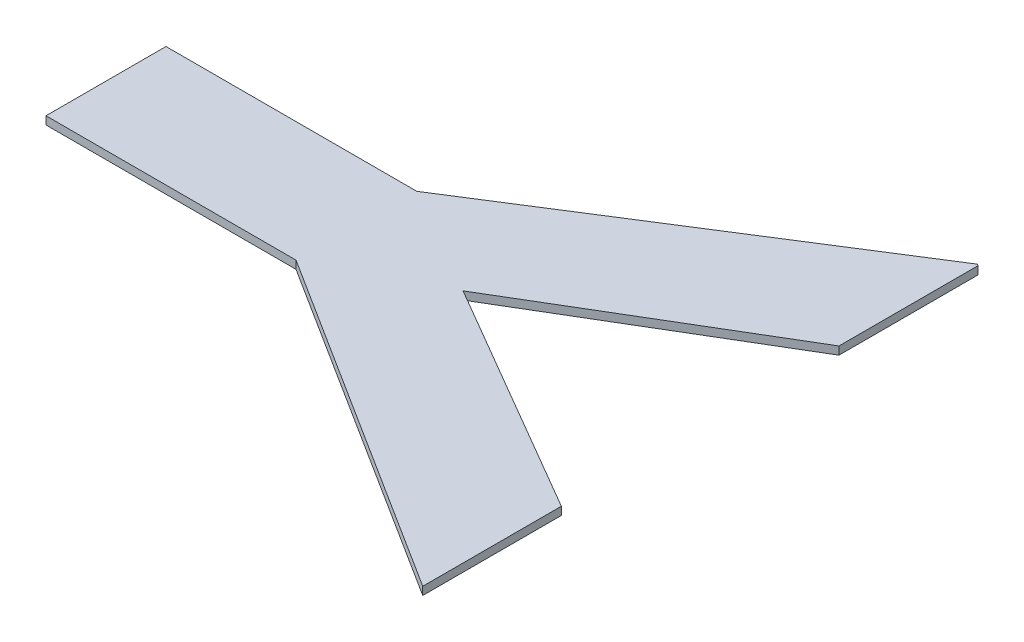
ISO-10303-21;
HEADER;
FILE_DESCRIPTION(('STEP AP214'),'2;1');
FILE_NAME('part.step','',(''),(''),'','','');
FILE_SCHEMA(('AUTOMOTIVE_DESIGN { 1 0 10303 214 1 1 1 1 }'));
ENDSEC;
DATA;
#1=APPLICATION_CONTEXT('core data for automotive mechanical design processes');
#2=APPLICATION_PROTOCOL_DEFINITION('international standard','automotive_design',2000,#1);
#3=PRODUCT_CONTEXT('',#1,'mechanical');
#4=PRODUCT('Part','Part','',(#3));
#5=PRODUCT_RELATED_PRODUCT_CATEGORY('part','',(#4));
#6=PRODUCT_DEFINITION_FORMATION('','',#4);
#7=PRODUCT_DEFINITION_CONTEXT('part definition',#1,'design');
#8=PRODUCT_DEFINITION('design','',#6,#7);
#9=PRODUCT_DEFINITION_SHAPE('','',#8);
#10=(LENGTH_UNIT() NAMED_UNIT(*) SI_UNIT(.MILLI.,.METRE.));
#11=(NAMED_UNIT(*) PLANE_ANGLE_UNIT() SI_UNIT($,.RADIAN.));
#12=(NAMED_UNIT(*) SI_UNIT($,.STERADIAN.) SOLID_ANGLE_UNIT());
#13=UNCERTAINTY_MEASURE_WITH_UNIT(LENGTH_MEASURE(1.E-05),#10,'distance_accuracy_value','');
#14=(GEOMETRIC_REPRESENTATION_CONTEXT(3) GLOBAL_UNCERTAINTY_ASSIGNED_CONTEXT((#13)) GLOBAL_UNIT_ASSIGNED_CONTEXT((#10,
#11,#12)) REPRESENTATION_CONTEXT('',''));
#15=CARTESIAN_POINT('',(0.,0.,0.));
#16=DIRECTION('',(0.,0.,1.));
#17=DIRECTION('',(1.,0.,0.));
#18=AXIS2_PLACEMENT_3D('',#15,#16,#17);
#19=CARTESIAN_POINT('',(-8.631267976045,2.15,0.));
#20=DIRECTION('',(0.,1.,0.));
#21=DIRECTION('',(0.,0.,1.));
#22=AXIS2_PLACEMENT_3D('',#19,#20,#21);
#23=PLANE('',#22);
#24=DIRECTION('',(-1.,0.,0.));
#25=VECTOR('',#24,1.);
#26=CARTESIAN_POINT('',(-8.631267976045,2.15,-0.805008260678));
#27=LINE('',#26,#25);
#28=CARTESIAN_POINT('',(0.513530626071366,2.15,-0.805008260677422));
#29=VERTEX_POINT('',#28);
#30=CARTESIAN_POINT('',(0.200543494761,2.15,-0.805008260678));
#31=VERTEX_POINT('',#30);
#32=EDGE_CURVE('E149',#29,#31,#27,.T.);
#33=ORIENTED_EDGE('',*,*,#32,.F.);
#34=DIRECTION('',(-0.845078836052363,0.,0.53464171260423));
#35=VECTOR('',#34,1.);
#36=CARTESIAN_POINT('',(-6.381016962165,2.15,3.556848376778));
#37=LINE('',#36,#35);
#38=CARTESIAN_POINT('',(0.941954956039253,2.15,-1.07605222453429));
#39=VERTEX_POINT('',#38);
#40=EDGE_CURVE('E144',#39,#29,#37,.T.);
#41=ORIENTED_EDGE('',*,*,#40,.F.);
#42=DIRECTION('',(0.844742850910072,0.,0.535172416924045));
#43=VECTOR('',#42,1.);
#44=CARTESIAN_POINT('',(-5.402940834483,2.15,-5.095752671465));
#45=LINE('',#44,#43);
#46=CARTESIAN_POINT('',(0.943995590928864,2.15,-1.07475941512578));
#47=VERTEX_POINT('',#46);
#48=EDGE_CURVE('E141',#39,#47,#45,.T.);
#49=ORIENTED_EDGE('',*,*,#48,.T.);
#50=DIRECTION('',(0.,0.,-1.));
#51=VECTOR('',#50,1.);
#52=CARTESIAN_POINT('',(0.943995590929,2.15,0.));
#53=LINE('',#52,#51);
#54=CARTESIAN_POINT('',(0.943995590929112,2.15,-0.901298743012813));
#55=VERTEX_POINT('',#54);
#56=EDGE_CURVE('E134',#55,#47,#53,.T.);
#57=ORIENTED_EDGE('',*,*,#56,.F.);
#58=DIRECTION('',(0.859308687773046,0.,-0.511457309184027));
#59=VECTOR('',#58,1.);
#60=CARTESIAN_POINT('',(-6.522608920344,2.15,3.542796267797));
#61=LINE('',#60,#59);
#62=CARTESIAN_POINT('',(0.649956497286982,2.15,-0.726287776907821));
#63=VERTEX_POINT('',#62);
#64=EDGE_CURVE('E128',#63,#55,#61,.T.);
#65=ORIENTED_EDGE('',*,*,#64,.F.);
#66=DIRECTION('',(-0.86394406409241,0.,-0.503587781940239));
#67=VECTOR('',#66,1.);
#68=CARTESIAN_POINT('',(-5.961556138979,2.15,-4.580098598867));
#69=LINE('',#68,#67);
#70=CARTESIAN_POINT('',(0.943995590928875,2.15,-0.554894163449785));
#71=VERTEX_POINT('',#70);
#72=EDGE_CURVE('E122',#71,#63,#69,.T.);
#73=ORIENTED_EDGE('',*,*,#72,.F.);
#74=DIRECTION('',(0.,0.,-1.));
#75=VECTOR('',#74,1.);
#76=CARTESIAN_POINT('',(0.943995590929,2.15,0.));
#77=LINE('',#76,#75);
#78=CARTESIAN_POINT('',(0.943995590928862,2.15,-0.381950255999783));
#79=VERTEX_POINT('',#78);
#80=EDGE_CURVE('E116',#79,#71,#77,.T.);
#81=ORIENTED_EDGE('',*,*,#80,.F.);
#82=DIRECTION('',(0.844742850910072,0.,0.535172416924045));
#83=VECTOR('',#82,1.);
#84=CARTESIAN_POINT('',(-5.716148128282,2.15,-4.601370648171));
#85=LINE('',#84,#83);
#86=CARTESIAN_POINT('',(0.512497096743925,2.15,-0.655318763093879));
#87=VERTEX_POINT('',#86);
#88=EDGE_CURVE('E92',#87,#79,#85,.T.);
#89=ORIENTED_EDGE('',*,*,#88,.F.);
#90=DIRECTION('',(1.,0.,0.));
#91=VECTOR('',#90,1.);
#92=CARTESIAN_POINT('',(-8.631267976045,2.15,-0.655318763094));
#93=LINE('',#92,#91);
#94=CARTESIAN_POINT('',(0.200543494761,2.15,-0.655318763094));
#95=VERTEX_POINT('',#94);
#96=EDGE_CURVE('E94',#95,#87,#93,.T.);
#97=ORIENTED_EDGE('',*,*,#96,.F.);
#98=DIRECTION('',(0.,0.,1.));
#99=VECTOR('',#98,1.);
#100=CARTESIAN_POINT('',(0.200543494761,2.15,0.));
#101=LINE('',#100,#99);
#102=EDGE_CURVE('E20',#31,#95,#101,.T.);
#103=ORIENTED_EDGE('',*,*,#102,.F.);
#104=EDGE_LOOP('',(#33,#41,#49,#57,#65,#73,#81,#89,#97,#103));
#105=FACE_BOUND('',#104,.T.);
#106=ADVANCED_FACE('F17',(#105),#23,.F.);
#107=CARTESIAN_POINT('',(0.200543494761,2.16,0.));
#108=DIRECTION('',(-1.,0.,0.));
#109=DIRECTION('',(0.,0.,1.));
#110=AXIS2_PLACEMENT_3D('',#107,#108,#109);
#111=PLANE('',#110);
#112=DIRECTION('',(0.,0.,1.));
#113=VECTOR('',#112,1.);
#114=CARTESIAN_POINT('',(0.200543494761,2.16,0.));
#115=LINE('',#114,#113);
#116=CARTESIAN_POINT('',(0.200543494761,2.16,-0.805008260678));
#117=VERTEX_POINT('',#116);
#118=CARTESIAN_POINT('',(0.200543494761,2.16,-0.655318763094));
#119=VERTEX_POINT('',#118);
#120=EDGE_CURVE('E153',#117,#119,#115,.T.);
#121=ORIENTED_EDGE('',*,*,#120,.F.);
#122=DIRECTION('',(0.,1.,0.));
#123=VECTOR('',#122,1.);
#124=CARTESIAN_POINT('',(0.200543494761,2.16,-0.805008260678));
#125=LINE('',#124,#123);
#126=EDGE_CURVE('E105',#31,#117,#125,.T.);
#127=ORIENTED_EDGE('',*,*,#126,.F.);
#128=ORIENTED_EDGE('',*,*,#102,.T.);
#129=DIRECTION('',(0.,1.,0.));
#130=VECTOR('',#129,1.);
#131=CARTESIAN_POINT('',(0.200543494761,2.16,-0.655318763094));
#132=LINE('',#131,#130);
#133=EDGE_CURVE('E100',#119,#95,#132,.F.);
#134=ORIENTED_EDGE('',*,*,#133,.F.);
#135=EDGE_LOOP('',(#121,#127,#128,#134));
#136=FACE_BOUND('',#135,.T.);
#137=ADVANCED_FACE('F102',(#136),#111,.T.);
#138=CARTESIAN_POINT('',(-8.631267976045,2.16,-0.655318763094));
#139=DIRECTION('',(0.,0.,1.));
#140=DIRECTION('',(1.,0.,0.));
#141=AXIS2_PLACEMENT_3D('',#138,#139,#140);
#142=PLANE('',#141);
#143=DIRECTION('',(1.,0.,0.));
#144=VECTOR('',#143,1.);
#145=CARTESIAN_POINT('',(-8.631267976045,2.16,-0.655318763094));
#146=LINE('',#145,#144);
#147=CARTESIAN_POINT('',(0.512497096743925,2.16,-0.655318763093879));
#148=VERTEX_POINT('',#147);
#149=EDGE_CURVE('E109',#119,#148,#146,.T.);
#150=ORIENTED_EDGE('',*,*,#149,.F.);
#151=ORIENTED_EDGE('',*,*,#133,.T.);
#152=ORIENTED_EDGE('',*,*,#96,.T.);
#153=DIRECTION('',(0.,1.,0.));
#154=VECTOR('',#153,1.);
#155=CARTESIAN_POINT('',(0.512497096743696,2.16,-0.655318763093517));
#156=LINE('',#155,#154);
#157=EDGE_CURVE('E112',#148,#87,#156,.F.);
#158=ORIENTED_EDGE('',*,*,#157,.F.);
#159=EDGE_LOOP('',(#150,#151,#152,#158));
#160=FACE_BOUND('',#159,.T.);
#161=ADVANCED_FACE('F107',(#160),#142,.T.);
#162=CARTESIAN_POINT('',(-5.716148128282,2.16,-4.601370648171));
#163=DIRECTION('',(-0.535172416924045,0.,0.844742850910072));
#164=DIRECTION('',(0.844742850910072,0.,0.535172416924045));
#165=AXIS2_PLACEMENT_3D('',#162,#163,#164);
#166=PLANE('',#165);
#167=DIRECTION('',(0.84474285091055,0.,0.535172416923291));
#168=VECTOR('',#167,1.);
#169=CARTESIAN_POINT('',(0.512497096744001,2.16,-0.655318763094));
#170=LINE('',#169,#168);
#171=CARTESIAN_POINT('',(0.943995590928726,2.16,-0.381950255999565));
#172=VERTEX_POINT('',#171);
#173=EDGE_CURVE('E156',#148,#172,#170,.T.);
#174=ORIENTED_EDGE('',*,*,#173,.F.);
#175=ORIENTED_EDGE('',*,*,#157,.T.);
#176=ORIENTED_EDGE('',*,*,#88,.T.);
#177=DIRECTION('',(0.,1.,0.));
#178=VECTOR('',#177,1.);
#179=CARTESIAN_POINT('',(0.943995590929,2.16,-0.381950256));
#180=LINE('',#179,#178);
#181=EDGE_CURVE('E119',#172,#79,#180,.F.);
#182=ORIENTED_EDGE('',*,*,#181,.F.);
#183=EDGE_LOOP('',(#174,#175,#176,#182));
#184=FACE_BOUND('',#183,.T.);
#185=ADVANCED_FACE('F212',(#184),#166,.T.);
#186=CARTESIAN_POINT('',(0.943995590929,2.16,0.));
#187=DIRECTION('',(1.,0.,0.));
#188=DIRECTION('',(0.,0.,-1.));
#189=AXIS2_PLACEMENT_3D('',#186,#187,#188);
#190=PLANE('',#189);
#191=DIRECTION('',(0.,0.,1.));
#192=VECTOR('',#191,1.);
#193=CARTESIAN_POINT('',(0.943995590929,2.16,0.));
#194=LINE('',#193,#192);
#195=CARTESIAN_POINT('',(0.943995590928875,2.16,-0.554894163449785));
#196=VERTEX_POINT('',#195);
#197=EDGE_CURVE('E159',#172,#196,#194,.F.);
#198=ORIENTED_EDGE('',*,*,#197,.F.);
#199=ORIENTED_EDGE('',*,*,#181,.T.);
#200=ORIENTED_EDGE('',*,*,#80,.T.);
#201=DIRECTION('',(0.,1.,0.));
#202=VECTOR('',#201,1.);
#203=CARTESIAN_POINT('',(0.943995590928501,2.16,-0.554894163449141));
#204=LINE('',#203,#202);
#205=EDGE_CURVE('E125',#196,#71,#204,.F.);
#206=ORIENTED_EDGE('',*,*,#205,.F.);
#207=EDGE_LOOP('',(#198,#199,#200,#206));
#208=FACE_BOUND('',#207,.T.);
#209=ADVANCED_FACE('F208',(#208),#190,.T.);
#210=CARTESIAN_POINT('',(-5.961556138979,2.16,-4.580098598867));
#211=DIRECTION('',(0.503587781940239,0.,-0.86394406409241));
#212=DIRECTION('',(-0.86394406409241,0.,-0.503587781940239));
#213=AXIS2_PLACEMENT_3D('',#210,#211,#212);
#214=PLANE('',#213);
#215=DIRECTION('',(-0.863944064093157,0.,-0.503587781938958));
#216=VECTOR('',#215,1.);
#217=CARTESIAN_POINT('',(0.943995590929,2.16,-0.55489416345));
#218=LINE('',#217,#216);
#219=CARTESIAN_POINT('',(0.649956497286921,2.16,-0.726287776907715));
#220=VERTEX_POINT('',#219);
#221=EDGE_CURVE('E162',#196,#220,#218,.T.);
#222=ORIENTED_EDGE('',*,*,#221,.F.);
#223=ORIENTED_EDGE('',*,*,#205,.T.);
#224=ORIENTED_EDGE('',*,*,#72,.T.);
#225=DIRECTION('',(0.,1.,0.));
#226=VECTOR('',#225,1.);
#227=CARTESIAN_POINT('',(0.649956497287173,2.16,-0.726287776907707));
#228=LINE('',#227,#226);
#229=EDGE_CURVE('E131',#220,#63,#228,.F.);
#230=ORIENTED_EDGE('',*,*,#229,.F.);
#231=EDGE_LOOP('',(#222,#223,#224,#230));
#232=FACE_BOUND('',#231,.T.);
#233=ADVANCED_FACE('F204',(#232),#214,.T.);
#234=CARTESIAN_POINT('',(-6.522608920344,2.16,3.542796267797));
#235=DIRECTION('',(0.511457309184027,0.,0.859308687773046));
#236=DIRECTION('',(0.859308687773046,0.,-0.511457309184027));
#237=AXIS2_PLACEMENT_3D('',#234,#235,#236);
#238=PLANE('',#237);
#239=DIRECTION('',(0.859308687772249,0.,-0.511457309185366));
#240=VECTOR('',#239,1.);
#241=CARTESIAN_POINT('',(0.649956497287,2.16,-0.726287776908));
#242=LINE('',#241,#240);
#243=CARTESIAN_POINT('',(0.943995590929223,2.16,-0.901298743012625));
#244=VERTEX_POINT('',#243);
#245=EDGE_CURVE('E165',#220,#244,#242,.T.);
#246=ORIENTED_EDGE('',*,*,#245,.F.);
#247=ORIENTED_EDGE('',*,*,#229,.T.);
#248=ORIENTED_EDGE('',*,*,#64,.T.);
#249=DIRECTION('',(0.,1.,0.));
#250=VECTOR('',#249,1.);
#251=CARTESIAN_POINT('',(0.943995590929,2.16,-0.901298743013));
#252=LINE('',#251,#250);
#253=EDGE_CURVE('E136',#244,#55,#252,.F.);
#254=ORIENTED_EDGE('',*,*,#253,.F.);
#255=EDGE_LOOP('',(#246,#247,#248,#254));
#256=FACE_BOUND('',#255,.T.);
#257=ADVANCED_FACE('F200',(#256),#238,.T.);
#258=CARTESIAN_POINT('',(0.943995590929,2.16,0.));
#259=DIRECTION('',(1.,0.,0.));
#260=DIRECTION('',(0.,0.,-1.));
#261=AXIS2_PLACEMENT_3D('',#258,#259,#260);
#262=PLANE('',#261);
#263=DIRECTION('',(0.,0.,1.));
#264=VECTOR('',#263,1.);
#265=CARTESIAN_POINT('',(0.943995590929,2.16,0.));
#266=LINE('',#265,#264);
#267=CARTESIAN_POINT('',(0.943995590928864,2.16,-1.07475941512578));
#268=VERTEX_POINT('',#267);
#269=EDGE_CURVE('E168',#244,#268,#266,.F.);
#270=ORIENTED_EDGE('',*,*,#269,.F.);
#271=ORIENTED_EDGE('',*,*,#253,.T.);
#272=ORIENTED_EDGE('',*,*,#56,.T.);
#273=DIRECTION('',(0.,1.,0.));
#274=VECTOR('',#273,1.);
#275=CARTESIAN_POINT('',(0.943995590928455,2.16,-1.07475941512514));
#276=LINE('',#275,#274);
#277=EDGE_CURVE('E139',#47,#268,#276,.T.);
#278=ORIENTED_EDGE('',*,*,#277,.T.);
#279=EDGE_LOOP('',(#270,#271,#272,#278));
#280=FACE_BOUND('',#279,.T.);
#281=ADVANCED_FACE('F197',(#280),#262,.T.);
#282=CARTESIAN_POINT('',(-5.402940834483,2.16,-5.095752671465));
#283=DIRECTION('',(-0.535172416924045,0.,0.844742850910072));
#284=DIRECTION('',(0.844742850910072,0.,0.535172416924045));
#285=AXIS2_PLACEMENT_3D('',#282,#283,#284);
#286=PLANE('',#285);
#287=DIRECTION('',(0.,1.,0.));
#288=VECTOR('',#287,1.);
#289=CARTESIAN_POINT('',(0.941954956040398,2.16,-1.07605222453279));
#290=LINE('',#289,#288);
#291=CARTESIAN_POINT('',(0.941954956039156,2.16,-1.07605222453414));
#292=VERTEX_POINT('',#291);
#293=EDGE_CURVE('E146',#292,#39,#290,.F.);
#294=ORIENTED_EDGE('',*,*,#293,.F.);
#295=DIRECTION('',(-0.844742850976254,0.,-0.53517241681958));
#296=VECTOR('',#295,1.);
#297=CARTESIAN_POINT('',(0.943995590929,2.16,-1.074759415126));
#298=LINE('',#297,#296);
#299=EDGE_CURVE('E171',#268,#292,#298,.T.);
#300=ORIENTED_EDGE('',*,*,#299,.F.);
#301=ORIENTED_EDGE('',*,*,#277,.F.);
#302=ORIENTED_EDGE('',*,*,#48,.F.);
#303=EDGE_LOOP('',(#294,#300,#301,#302));
#304=FACE_BOUND('',#303,.T.);
#305=ADVANCED_FACE('F181',(#304),#286,.F.);
#306=CARTESIAN_POINT('',(-6.381016962165,2.16,3.556848376778));
#307=DIRECTION('',(-0.53464171260423,0.,-0.845078836052363));
#308=DIRECTION('',(-0.845078836052363,0.,0.53464171260423));
#309=AXIS2_PLACEMENT_3D('',#306,#307,#308);
#310=PLANE('',#309);
#311=DIRECTION('',(-0.845078836052488,0.,0.534641712604032));
#312=VECTOR('',#311,1.);
#313=CARTESIAN_POINT('',(0.941954956039,2.16,-1.076052224535));
#314=LINE('',#313,#312);
#315=CARTESIAN_POINT('',(0.513530626071731,2.16,-0.805008260676845));
#316=VERTEX_POINT('',#315);
#317=EDGE_CURVE('E26',#292,#316,#314,.T.);
#318=ORIENTED_EDGE('',*,*,#317,.F.);
#319=ORIENTED_EDGE('',*,*,#293,.T.);
#320=ORIENTED_EDGE('',*,*,#40,.T.);
#321=DIRECTION('',(0.,1.,0.));
#322=VECTOR('',#321,1.);
#323=CARTESIAN_POINT('',(0.513530626071001,2.16,-0.805008260678));
#324=LINE('',#323,#322);
#325=EDGE_CURVE('E35',#316,#29,#324,.F.);
#326=ORIENTED_EDGE('',*,*,#325,.F.);
#327=EDGE_LOOP('',(#318,#319,#320,#326));
#328=FACE_BOUND('',#327,.T.);
#329=ADVANCED_FACE('F178',(#328),#310,.T.);
#330=CARTESIAN_POINT('',(-8.631267976045,2.16,-0.805008260678));
#331=DIRECTION('',(0.,0.,-1.));
#332=DIRECTION('',(-1.,0.,0.));
#333=AXIS2_PLACEMENT_3D('',#330,#331,#332);
#334=PLANE('',#333);
#335=DIRECTION('',(1.,0.,0.));
#336=VECTOR('',#335,1.);
#337=CARTESIAN_POINT('',(-8.631267976045,2.16,-0.805008260678));
#338=LINE('',#337,#336);
#339=EDGE_CURVE('E11',#316,#117,#338,.F.);
#340=ORIENTED_EDGE('',*,*,#339,.F.);
#341=ORIENTED_EDGE('',*,*,#325,.T.);
#342=ORIENTED_EDGE('',*,*,#32,.T.);
#343=ORIENTED_EDGE('',*,*,#126,.T.);
#344=EDGE_LOOP('',(#340,#341,#342,#343));
#345=FACE_BOUND('',#344,.T.);
#346=ADVANCED_FACE('F184',(#345),#334,.T.);
#347=CARTESIAN_POINT('',(-8.631267976045,2.16,0.));
#348=DIRECTION('',(0.,1.,0.));
#349=DIRECTION('',(0.,0.,1.));
#350=AXIS2_PLACEMENT_3D('',#347,#348,#349);
#351=PLANE('',#350);
#352=ORIENTED_EDGE('',*,*,#317,.T.);
#353=ORIENTED_EDGE('',*,*,#339,.T.);
#354=ORIENTED_EDGE('',*,*,#120,.T.);
#355=ORIENTED_EDGE('',*,*,#149,.T.);
#356=ORIENTED_EDGE('',*,*,#173,.T.);
#357=ORIENTED_EDGE('',*,*,#197,.T.);
#358=ORIENTED_EDGE('',*,*,#221,.T.);
#359=ORIENTED_EDGE('',*,*,#245,.T.);
#360=ORIENTED_EDGE('',*,*,#269,.T.);
#361=ORIENTED_EDGE('',*,*,#299,.T.);
#362=EDGE_LOOP('',(#352,#353,#354,#355,#356,#357,#358,#359,#360,#361));
#363=FACE_BOUND('',#362,.T.);
#364=ADVANCED_FACE('F176',(#363),#351,.T.);
#365=CLOSED_SHELL('',(#106,#137,#161,#185,#209,#233,#257,#281,#305,#329,#346,#364));
#366=MANIFOLD_SOLID_BREP('B1',#365);
#367=ADVANCED_BREP_SHAPE_REPRESENTATION('',(#18,#366),#14);
#368=SHAPE_DEFINITION_REPRESENTATION(#9,#367);
ENDSEC;
END-ISO-10303-21;
